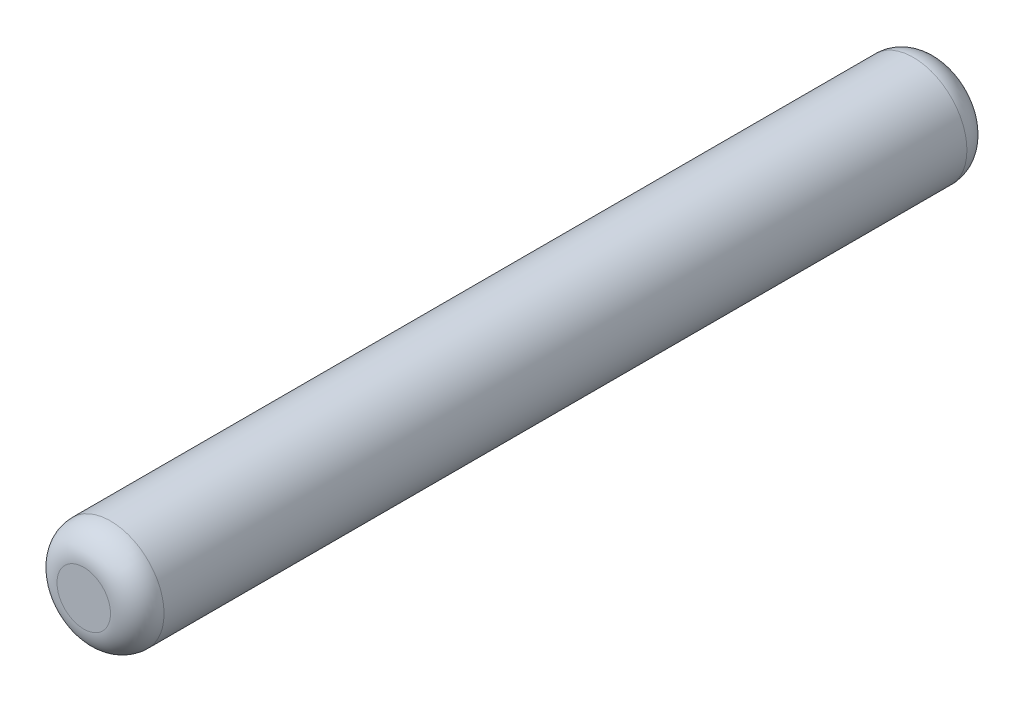
ISO-10303-21;
HEADER;
FILE_DESCRIPTION(('STEP AP214'),'2;1');
FILE_NAME('part.step','',(''),(''),'','','');
FILE_SCHEMA(('AUTOMOTIVE_DESIGN { 1 0 10303 214 1 1 1 1 }'));
ENDSEC;
DATA;
#1=APPLICATION_CONTEXT('core data for automotive mechanical design processes');
#2=APPLICATION_PROTOCOL_DEFINITION('international standard','automotive_design',2000,#1);
#3=PRODUCT_CONTEXT('',#1,'mechanical');
#4=PRODUCT('Part','Part','',(#3));
#5=PRODUCT_RELATED_PRODUCT_CATEGORY('part','',(#4));
#6=PRODUCT_DEFINITION_FORMATION('','',#4);
#7=PRODUCT_DEFINITION_CONTEXT('part definition',#1,'design');
#8=PRODUCT_DEFINITION('design','',#6,#7);
#9=PRODUCT_DEFINITION_SHAPE('','',#8);
#10=(LENGTH_UNIT() NAMED_UNIT(*) SI_UNIT(.MILLI.,.METRE.));
#11=(NAMED_UNIT(*) PLANE_ANGLE_UNIT() SI_UNIT($,.RADIAN.));
#12=(NAMED_UNIT(*) SI_UNIT($,.STERADIAN.) SOLID_ANGLE_UNIT());
#13=UNCERTAINTY_MEASURE_WITH_UNIT(LENGTH_MEASURE(1.E-05),#10,'distance_accuracy_value','');
#14=(GEOMETRIC_REPRESENTATION_CONTEXT(3) GLOBAL_UNCERTAINTY_ASSIGNED_CONTEXT((#13)) GLOBAL_UNIT_ASSIGNED_CONTEXT((#10,
#11,#12)) REPRESENTATION_CONTEXT('',''));
#15=CARTESIAN_POINT('',(0.,0.,0.));
#16=DIRECTION('',(0.,0.,1.));
#17=DIRECTION('',(1.,0.,0.));
#18=AXIS2_PLACEMENT_3D('',#15,#16,#17);
#19=CARTESIAN_POINT('',(0.,0.,400.));
#20=DIRECTION('',(0.,0.,-1.));
#21=DIRECTION('',(-1.,0.,0.));
#22=AXIS2_PLACEMENT_3D('',#19,#20,#21);
#23=CYLINDRICAL_SURFACE('',#22,50.);
#24=CARTESIAN_POINT('',(0.,0.,-375.));
#25=DIRECTION('',(0.,0.,1.));
#26=DIRECTION('',(1.,0.,0.));
#27=AXIS2_PLACEMENT_3D('',#24,#25,#26);
#28=CIRCLE('',#27,50.);
#29=CARTESIAN_POINT('',(50.,0.,-375.));
#30=VERTEX_POINT('',#29);
#31=EDGE_CURVE('E42',#30,#30,#28,.T.);
#32=ORIENTED_EDGE('',*,*,#31,.T.);
#33=EDGE_LOOP('',(#32));
#34=FACE_BOUND('',#33,.T.);
#35=CARTESIAN_POINT('',(0.,0.,375.));
#36=DIRECTION('',(0.,0.,1.));
#37=DIRECTION('',(1.,0.,0.));
#38=AXIS2_PLACEMENT_3D('',#35,#36,#37);
#39=CIRCLE('',#38,50.);
#40=CARTESIAN_POINT('',(50.,0.,375.));
#41=VERTEX_POINT('',#40);
#42=EDGE_CURVE('E46',#41,#41,#39,.F.);
#43=ORIENTED_EDGE('',*,*,#42,.T.);
#44=EDGE_LOOP('',(#43));
#45=FACE_BOUND('',#44,.T.);
#46=ADVANCED_FACE('F31',(#34,#45),#23,.T.);
#47=CARTESIAN_POINT('',(0.,0.,400.));
#48=DIRECTION('',(0.,0.,1.));
#49=DIRECTION('',(1.,0.,0.));
#50=AXIS2_PLACEMENT_3D('',#47,#48,#49);
#51=PLANE('',#50);
#52=CARTESIAN_POINT('',(0.,0.,400.));
#53=DIRECTION('',(0.,0.,1.));
#54=DIRECTION('',(1.,0.,0.));
#55=AXIS2_PLACEMENT_3D('',#52,#53,#54);
#56=CIRCLE('',#55,25.);
#57=CARTESIAN_POINT('',(25.,0.,400.));
#58=VERTEX_POINT('',#57);
#59=EDGE_CURVE('E10',#58,#58,#56,.T.);
#60=ORIENTED_EDGE('',*,*,#59,.T.);
#61=EDGE_LOOP('',(#60));
#62=FACE_BOUND('',#61,.T.);
#63=ADVANCED_FACE('F62',(#62),#51,.T.);
#64=CARTESIAN_POINT('',(0.,0.,-400.));
#65=DIRECTION('',(0.,0.,1.));
#66=DIRECTION('',(1.,0.,0.));
#67=AXIS2_PLACEMENT_3D('',#64,#65,#66);
#68=PLANE('',#67);
#69=CARTESIAN_POINT('',(0.,0.,-400.));
#70=DIRECTION('',(0.,0.,1.));
#71=DIRECTION('',(1.,0.,0.));
#72=AXIS2_PLACEMENT_3D('',#69,#70,#71);
#73=CIRCLE('',#72,25.);
#74=CARTESIAN_POINT('',(25.,0.,-400.));
#75=VERTEX_POINT('',#74);
#76=EDGE_CURVE('E38',#75,#75,#73,.F.);
#77=ORIENTED_EDGE('',*,*,#76,.T.);
#78=EDGE_LOOP('',(#77));
#79=FACE_BOUND('',#78,.T.);
#80=ADVANCED_FACE('F59',(#79),#68,.F.);
#81=CARTESIAN_POINT('',(0.,0.,-375.));
#82=DIRECTION('',(0.,0.,1.));
#83=DIRECTION('',(1.,0.,0.));
#84=AXIS2_PLACEMENT_3D('',#81,#82,#83);
#85=DEGENERATE_TOROIDAL_SURFACE('',#84,25.,25.,.T.);
#86=ORIENTED_EDGE('',*,*,#76,.F.);
#87=EDGE_LOOP('',(#86));
#88=FACE_BOUND('',#87,.T.);
#89=ORIENTED_EDGE('',*,*,#31,.F.);
#90=EDGE_LOOP('',(#89));
#91=FACE_BOUND('',#90,.T.);
#92=ADVANCED_FACE('F55',(#88,#91),#85,.T.);
#93=CARTESIAN_POINT('',(0.,0.,375.));
#94=DIRECTION('',(0.,0.,1.));
#95=DIRECTION('',(1.,0.,0.));
#96=AXIS2_PLACEMENT_3D('',#93,#94,#95);
#97=DEGENERATE_TOROIDAL_SURFACE('',#96,25.,25.,.T.);
#98=ORIENTED_EDGE('',*,*,#42,.F.);
#99=EDGE_LOOP('',(#98));
#100=FACE_BOUND('',#99,.T.);
#101=ORIENTED_EDGE('',*,*,#59,.F.);
#102=EDGE_LOOP('',(#101));
#103=FACE_BOUND('',#102,.T.);
#104=ADVANCED_FACE('F33',(#100,#103),#97,.T.);
#105=CLOSED_SHELL('',(#46,#63,#80,#92,#104));
#106=MANIFOLD_SOLID_BREP('B2',#105);
#107=ADVANCED_BREP_SHAPE_REPRESENTATION('',(#18,#106),#14);
#108=SHAPE_DEFINITION_REPRESENTATION(#9,#107);
ENDSEC;
END-ISO-10303-21;
